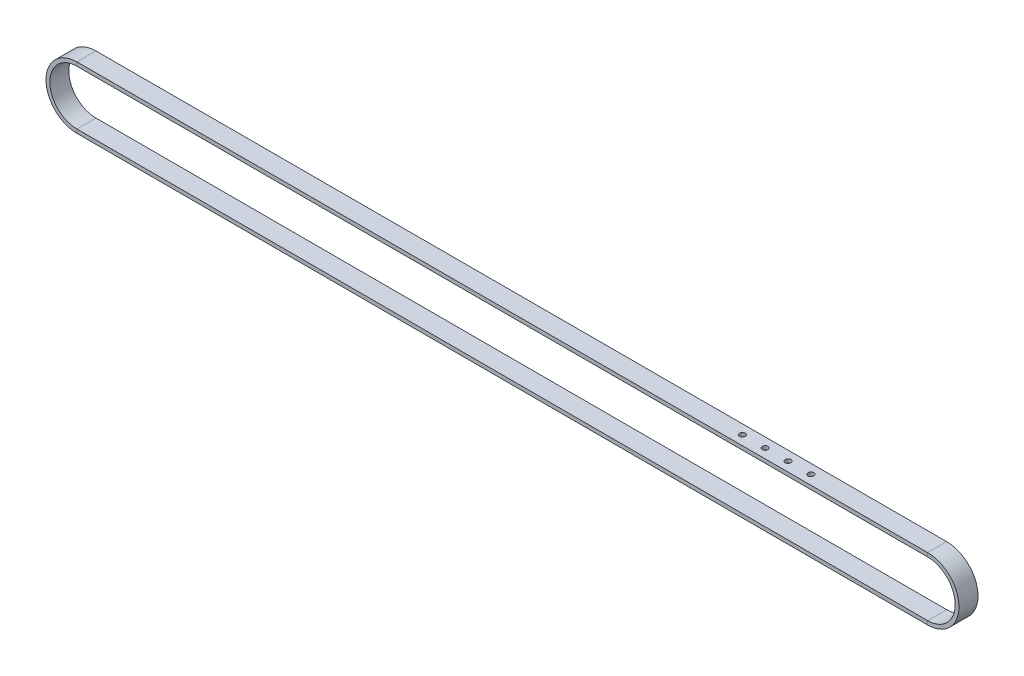
ISO-10303-21;
HEADER;
FILE_DESCRIPTION(('STEP AP214'),'2;1');
FILE_NAME('part.step','',(''),(''),'','','');
FILE_SCHEMA(('AUTOMOTIVE_DESIGN { 1 0 10303 214 1 1 1 1 }'));
ENDSEC;
DATA;
#1=APPLICATION_CONTEXT('core data for automotive mechanical design processes');
#2=APPLICATION_PROTOCOL_DEFINITION('international standard','automotive_design',2000,#1);
#3=PRODUCT_CONTEXT('',#1,'mechanical');
#4=PRODUCT('Part','Part','',(#3));
#5=PRODUCT_RELATED_PRODUCT_CATEGORY('part','',(#4));
#6=PRODUCT_DEFINITION_FORMATION('','',#4);
#7=PRODUCT_DEFINITION_CONTEXT('part definition',#1,'design');
#8=PRODUCT_DEFINITION('design','',#6,#7);
#9=PRODUCT_DEFINITION_SHAPE('','',#8);
#10=(LENGTH_UNIT() NAMED_UNIT(*) SI_UNIT(.MILLI.,.METRE.));
#11=(NAMED_UNIT(*) PLANE_ANGLE_UNIT() SI_UNIT($,.RADIAN.));
#12=(NAMED_UNIT(*) SI_UNIT($,.STERADIAN.) SOLID_ANGLE_UNIT());
#13=UNCERTAINTY_MEASURE_WITH_UNIT(LENGTH_MEASURE(1.E-05),#10,'distance_accuracy_value','');
#14=(GEOMETRIC_REPRESENTATION_CONTEXT(3) GLOBAL_UNCERTAINTY_ASSIGNED_CONTEXT((#13)) GLOBAL_UNIT_ASSIGNED_CONTEXT((#10,
#11,#12)) REPRESENTATION_CONTEXT('',''));
#15=CARTESIAN_POINT('',(0.,0.,0.));
#16=DIRECTION('',(0.,0.,1.));
#17=DIRECTION('',(1.,0.,0.));
#18=AXIS2_PLACEMENT_3D('',#15,#16,#17);
#19=CARTESIAN_POINT('',(-0.00679161377602913,14.2874973611801,-5.));
#20=DIRECTION('',(0.,0.,1.));
#21=DIRECTION('',(1.,0.,0.));
#22=AXIS2_PLACEMENT_3D('',#19,#20,#21);
#23=PLANE('',#22);
#24=CARTESIAN_POINT('',(0.,0.,-5.));
#25=DIRECTION('',(0.,0.,1.));
#26=DIRECTION('',(-0.000416983225536564,0.999999913062491,0.));
#27=AXIS2_PLACEMENT_3D('',#24,#25,#26);
#28=CIRCLE('',#27,16.2874987771746);
#29=CARTESIAN_POINT('',(-0.0067916137760915,16.2874973611801,-5.));
#30=VERTEX_POINT('',#29);
#31=CARTESIAN_POINT('',(-0.00869302676762121,-16.2874964573366,-5.));
#32=VERTEX_POINT('',#31);
#33=EDGE_CURVE('E170',#30,#32,#28,.T.);
#34=ORIENTED_EDGE('',*,*,#33,.F.);
#35=DIRECTION('',(0.,1.,0.));
#36=VECTOR('',#35,1.);
#37=CARTESIAN_POINT('',(-0.00679161377602913,14.2874973611801,-5.));
#38=LINE('',#37,#36);
#39=CARTESIAN_POINT('',(-0.0067916137760915,14.2874973611801,-5.));
#40=VERTEX_POINT('',#39);
#41=EDGE_CURVE('E172',#40,#30,#38,.T.);
#42=ORIENTED_EDGE('',*,*,#41,.F.);
#43=CARTESIAN_POINT('',(0.,0.,-5.));
#44=DIRECTION('',(0.,0.,1.));
#45=DIRECTION('',(-0.000475353579218308,0.999999887019481,0.));
#46=AXIS2_PLACEMENT_3D('',#43,#44,#45);
#47=CIRCLE('',#46,14.2874989753891);
#48=CARTESIAN_POINT('',(-0.00679161280192785,-14.2874973611805,-5.));
#49=VERTEX_POINT('',#48);
#50=EDGE_CURVE('E173',#40,#49,#47,.T.);
#51=ORIENTED_EDGE('',*,*,#50,.T.);
#52=DIRECTION('',(-0.000950706982846778,-0.999999548078014,0.));
#53=VECTOR('',#52,1.);
#54=CARTESIAN_POINT('',(-0.00679161280192926,-14.2874973611805,-5.));
#55=LINE('',#54,#53);
#56=EDGE_CURVE('E176',#49,#32,#55,.T.);
#57=ORIENTED_EDGE('',*,*,#56,.T.);
#58=EDGE_LOOP('',(#34,#42,#51,#57));
#59=FACE_BOUND('',#58,.T.);
#60=ADVANCED_FACE('F33',(#59),#23,.F.);
#61=CARTESIAN_POINT('',(0.,0.,0.));
#62=DIRECTION('',(0.,0.,1.));
#63=DIRECTION('',(1.,0.,0.));
#64=AXIS2_PLACEMENT_3D('',#61,#62,#63);
#65=CYLINDRICAL_SURFACE('',#64,16.2874987771746);
#66=CARTESIAN_POINT('',(0.,0.,5.));
#67=DIRECTION('',(0.,0.,1.));
#68=DIRECTION('',(-0.000416983225536564,0.999999913062491,0.));
#69=AXIS2_PLACEMENT_3D('',#66,#67,#68);
#70=CIRCLE('',#69,16.2874987771746);
#71=CARTESIAN_POINT('',(-0.0067916137760915,16.2874973611801,5.));
#72=VERTEX_POINT('',#71);
#73=CARTESIAN_POINT('',(-0.00869302676762121,-16.2874964573366,5.));
#74=VERTEX_POINT('',#73);
#75=EDGE_CURVE('E159',#72,#74,#70,.T.);
#76=ORIENTED_EDGE('',*,*,#75,.F.);
#77=DIRECTION('',(0.,0.,1.));
#78=VECTOR('',#77,1.);
#79=CARTESIAN_POINT('',(-0.00679161377602913,16.2874973611801,5.));
#80=LINE('',#79,#78);
#81=EDGE_CURVE('E167',#30,#72,#80,.T.);
#82=ORIENTED_EDGE('',*,*,#81,.F.);
#83=ORIENTED_EDGE('',*,*,#33,.T.);
#84=DIRECTION('',(0.,0.,1.));
#85=VECTOR('',#84,1.);
#86=CARTESIAN_POINT('',(-0.00869302676762282,-16.2874964573366,5.));
#87=LINE('',#86,#85);
#88=EDGE_CURVE('E162',#32,#74,#87,.T.);
#89=ORIENTED_EDGE('',*,*,#88,.T.);
#90=EDGE_LOOP('',(#76,#82,#83,#89));
#91=FACE_BOUND('',#90,.T.);
#92=ADVANCED_FACE('F340',(#91),#65,.T.);
#93=CARTESIAN_POINT('',(-0.00679161377602913,14.2874973611801,5.));
#94=DIRECTION('',(0.,0.,-1.));
#95=DIRECTION('',(-1.,0.,0.));
#96=AXIS2_PLACEMENT_3D('',#93,#94,#95);
#97=PLANE('',#96);
#98=CARTESIAN_POINT('',(0.,0.,5.));
#99=DIRECTION('',(0.,0.,1.));
#100=DIRECTION('',(-0.000475353579218308,0.999999887019481,0.));
#101=AXIS2_PLACEMENT_3D('',#98,#99,#100);
#102=CIRCLE('',#101,14.2874989753891);
#103=CARTESIAN_POINT('',(-0.0067916137760915,14.2874973611801,5.));
#104=VERTEX_POINT('',#103);
#105=CARTESIAN_POINT('',(-0.00679161280192785,-14.2874973611805,5.));
#106=VERTEX_POINT('',#105);
#107=EDGE_CURVE('E146',#104,#106,#102,.T.);
#108=ORIENTED_EDGE('',*,*,#107,.F.);
#109=DIRECTION('',(0.,-1.,0.));
#110=VECTOR('',#109,1.);
#111=CARTESIAN_POINT('',(-0.00679161377602913,14.2874973611801,5.));
#112=LINE('',#111,#110);
#113=EDGE_CURVE('E166',#72,#104,#112,.T.);
#114=ORIENTED_EDGE('',*,*,#113,.F.);
#115=ORIENTED_EDGE('',*,*,#75,.T.);
#116=DIRECTION('',(0.000950706982846778,0.999999548078014,0.));
#117=VECTOR('',#116,1.);
#118=CARTESIAN_POINT('',(-0.00679161280192926,-14.2874973611805,5.));
#119=LINE('',#118,#117);
#120=EDGE_CURVE('E130',#74,#106,#119,.T.);
#121=ORIENTED_EDGE('',*,*,#120,.T.);
#122=EDGE_LOOP('',(#108,#114,#115,#121));
#123=FACE_BOUND('',#122,.T.);
#124=ADVANCED_FACE('F157',(#123),#97,.F.);
#125=CARTESIAN_POINT('',(0.,0.,0.));
#126=DIRECTION('',(0.,0.,1.));
#127=DIRECTION('',(1.,0.,0.));
#128=AXIS2_PLACEMENT_3D('',#125,#126,#127);
#129=CYLINDRICAL_SURFACE('',#128,14.2874989753891);
#130=DIRECTION('',(0.,0.,-1.));
#131=VECTOR('',#130,1.);
#132=CARTESIAN_POINT('',(-0.00679161280192926,-14.2874973611805,5.));
#133=LINE('',#132,#131);
#134=EDGE_CURVE('E140',#106,#49,#133,.T.);
#135=ORIENTED_EDGE('',*,*,#134,.T.);
#136=ORIENTED_EDGE('',*,*,#50,.F.);
#137=DIRECTION('',(0.,0.,-1.));
#138=VECTOR('',#137,1.);
#139=CARTESIAN_POINT('',(-0.00679161377602913,14.2874973611801,5.));
#140=LINE('',#139,#138);
#141=EDGE_CURVE('E152',#104,#40,#140,.T.);
#142=ORIENTED_EDGE('',*,*,#141,.F.);
#143=ORIENTED_EDGE('',*,*,#107,.T.);
#144=EDGE_LOOP('',(#135,#136,#142,#143));
#145=FACE_BOUND('',#144,.T.);
#146=ADVANCED_FACE('F150',(#145),#129,.F.);
#147=CARTESIAN_POINT('',(-0.00679161280192698,-14.2874973611805,-5.));
#148=DIRECTION('',(0.,0.,1.));
#149=DIRECTION('',(1.,0.,0.));
#150=AXIS2_PLACEMENT_3D('',#147,#148,#149);
#151=PLANE('',#150);
#152=DIRECTION('',(0.999999887019497,-0.000475353545129085,0.));
#153=VECTOR('',#152,1.);
#154=CARTESIAN_POINT('',(-0.00869302676762022,-16.2874964573366,-5.));
#155=LINE('',#154,#153);
#156=CARTESIAN_POINT('',(447.491681208891,-16.5002174742748,-5.));
#157=VERTEX_POINT('',#156);
#158=EDGE_CURVE('E350',#32,#157,#155,.T.);
#159=ORIENTED_EDGE('',*,*,#158,.F.);
#160=ORIENTED_EDGE('',*,*,#56,.F.);
#161=DIRECTION('',(0.999999887019497,-0.000475353545129085,0.));
#162=VECTOR('',#161,1.);
#163=CARTESIAN_POINT('',(-0.00679161280192698,-14.2874973611805,-5.));
#164=LINE('',#163,#162);
#165=CARTESIAN_POINT('',(447.493107269207,-14.5002180485922,-5.));
#166=VERTEX_POINT('',#165);
#167=EDGE_CURVE('E143',#49,#166,#164,.T.);
#168=ORIENTED_EDGE('',*,*,#167,.T.);
#169=DIRECTION('',(-0.000475353545128899,-0.999999887019497,0.));
#170=VECTOR('',#169,1.);
#171=CARTESIAN_POINT('',(447.493107269167,-14.5002180485922,-5.));
#172=LINE('',#171,#170);
#173=EDGE_CURVE('E37',#166,#157,#172,.T.);
#174=ORIENTED_EDGE('',*,*,#173,.T.);
#175=EDGE_LOOP('',(#159,#160,#168,#174));
#176=FACE_BOUND('',#175,.T.);
#177=ADVANCED_FACE('F344',(#176),#151,.F.);
#178=CARTESIAN_POINT('',(-0.00869302676762022,-16.2874964573366,5.));
#179=DIRECTION('',(0.000475353545129085,0.999999887019497,0.));
#180=DIRECTION('',(-0.999999887019497,0.000475353545129085,0.));
#181=AXIS2_PLACEMENT_3D('',#178,#179,#180);
#182=PLANE('',#181);
#183=DIRECTION('',(0.999999887019497,-0.000475353545129085,0.));
#184=VECTOR('',#183,1.);
#185=CARTESIAN_POINT('',(-0.00869302676762022,-16.2874964573366,5.));
#186=LINE('',#185,#184);
#187=CARTESIAN_POINT('',(447.491747230197,-16.5002174840037,5.));
#188=VERTEX_POINT('',#187);
#189=EDGE_CURVE('E136',#74,#188,#186,.T.);
#190=ORIENTED_EDGE('',*,*,#189,.F.);
#191=ORIENTED_EDGE('',*,*,#88,.F.);
#192=ORIENTED_EDGE('',*,*,#158,.T.);
#193=DIRECTION('',(0.,0.,1.));
#194=VECTOR('',#193,1.);
#195=CARTESIAN_POINT('',(447.492156562076,-16.5002178226312,5.));
#196=LINE('',#195,#194);
#197=EDGE_CURVE('E78',#157,#188,#196,.T.);
#198=ORIENTED_EDGE('',*,*,#197,.T.);
#199=EDGE_LOOP('',(#190,#191,#192,#198));
#200=FACE_BOUND('',#199,.T.);
#201=ADVANCED_FACE('F337',(#200),#182,.F.);
#202=CARTESIAN_POINT('',(-0.00679161280192698,-14.2874973611805,5.));
#203=DIRECTION('',(0.,0.,-1.));
#204=DIRECTION('',(-1.,0.,0.));
#205=AXIS2_PLACEMENT_3D('',#202,#203,#204);
#206=PLANE('',#205);
#207=DIRECTION('',(0.999999887019497,-0.000475353545129085,0.));
#208=VECTOR('',#207,1.);
#209=CARTESIAN_POINT('',(-0.00679161280192698,-14.2874973611805,5.));
#210=LINE('',#209,#208);
#211=CARTESIAN_POINT('',(447.493107269207,-14.5002180485922,5.));
#212=VERTEX_POINT('',#211);
#213=EDGE_CURVE('E125',#106,#212,#210,.T.);
#214=ORIENTED_EDGE('',*,*,#213,.F.);
#215=ORIENTED_EDGE('',*,*,#120,.F.);
#216=ORIENTED_EDGE('',*,*,#189,.T.);
#217=DIRECTION('',(0.000475353545128899,0.999999887019497,0.));
#218=VECTOR('',#217,1.);
#219=CARTESIAN_POINT('',(447.493107269167,-14.5002180485922,5.));
#220=LINE('',#219,#218);
#221=EDGE_CURVE('E132',#188,#212,#220,.T.);
#222=ORIENTED_EDGE('',*,*,#221,.T.);
#223=EDGE_LOOP('',(#214,#215,#216,#222));
#224=FACE_BOUND('',#223,.T.);
#225=ADVANCED_FACE('F127',(#224),#206,.F.);
#226=CARTESIAN_POINT('',(-0.00679161280192698,-14.2874973611805,5.));
#227=DIRECTION('',(-0.000475353545129085,-0.999999887019497,0.));
#228=DIRECTION('',(0.999999887019497,-0.000475353545129085,0.));
#229=AXIS2_PLACEMENT_3D('',#226,#227,#228);
#230=PLANE('',#229);
#231=DIRECTION('',(0.,0.,-1.));
#232=VECTOR('',#231,1.);
#233=CARTESIAN_POINT('',(447.493107269167,-14.5002180485922,5.));
#234=LINE('',#233,#232);
#235=EDGE_CURVE('E276',#212,#166,#234,.T.);
#236=ORIENTED_EDGE('',*,*,#235,.T.);
#237=ORIENTED_EDGE('',*,*,#167,.F.);
#238=ORIENTED_EDGE('',*,*,#134,.F.);
#239=ORIENTED_EDGE('',*,*,#213,.T.);
#240=EDGE_LOOP('',(#236,#237,#238,#239));
#241=FACE_BOUND('',#240,.T.);
#242=ADVANCED_FACE('F142',(#241),#230,.F.);
#243=CARTESIAN_POINT('',(447.49310726868,14.500218048592,5.));
#244=DIRECTION('',(-0.000475353545128899,0.999999887019497,0.));
#245=DIRECTION('',(-0.999999887019497,-0.000475353545128899,0.));
#246=AXIS2_PLACEMENT_3D('',#243,#244,#245);
#247=PLANE('',#246);
#248=CARTESIAN_POINT('',(345.088089316183,14.4515394547695,0.0166150031191137));
#249=DIRECTION('',(-0.000475353545128899,0.999999887019497,0.));
#250=DIRECTION('',(-0.999999887019497,-0.000475353545128899,0.));
#251=AXIS2_PLACEMENT_3D('',#248,#249,#250);
#252=CIRCLE('',#251,1.49999999999997);
#253=CARTESIAN_POINT('',(343.588089485654,14.4508264244518,0.0166150031191137));
#254=VERTEX_POINT('',#253);
#255=EDGE_CURVE('E137',#254,#254,#252,.T.);
#256=ORIENTED_EDGE('',*,*,#255,.T.);
#257=EDGE_LOOP('',(#256));
#258=FACE_BOUND('',#257,.T.);
#259=CARTESIAN_POINT('',(357.088087960417,14.4572436973111,0.0166150031191137));
#260=DIRECTION('',(-0.000475353545128899,0.999999887019497,0.));
#261=DIRECTION('',(-0.999999887019497,-0.000475353545128899,0.));
#262=AXIS2_PLACEMENT_3D('',#259,#260,#261);
#263=CIRCLE('',#262,1.50000000000012);
#264=CARTESIAN_POINT('',(355.588088129888,14.4565306669934,0.0166150031191137));
#265=VERTEX_POINT('',#264);
#266=EDGE_CURVE('E406',#265,#265,#263,.T.);
#267=ORIENTED_EDGE('',*,*,#266,.T.);
#268=EDGE_LOOP('',(#267));
#269=FACE_BOUND('',#268,.T.);
#270=CARTESIAN_POINT('',(369.088086604651,14.4629479398526,0.0166150031191137));
#271=DIRECTION('',(-0.000475353545128899,0.999999887019497,0.));
#272=DIRECTION('',(-0.999999887019497,-0.000475353545128899,0.));
#273=AXIS2_PLACEMENT_3D('',#270,#271,#272);
#274=CIRCLE('',#273,1.50000000000007);
#275=CARTESIAN_POINT('',(367.588086774122,14.4622349095349,0.0166150031191137));
#276=VERTEX_POINT('',#275);
#277=EDGE_CURVE('E409',#276,#276,#274,.T.);
#278=ORIENTED_EDGE('',*,*,#277,.T.);
#279=EDGE_LOOP('',(#278));
#280=FACE_BOUND('',#279,.T.);
#281=CARTESIAN_POINT('',(381.088085248885,14.4686521823942,0.0166150031191137));
#282=DIRECTION('',(-0.000475353545128899,0.999999887019497,0.));
#283=DIRECTION('',(-0.999999887019497,-0.000475353545128899,0.));
#284=AXIS2_PLACEMENT_3D('',#281,#282,#283);
#285=CIRCLE('',#284,1.50000000000007);
#286=CARTESIAN_POINT('',(379.588085418356,14.4679391520765,0.0166150031191137));
#287=VERTEX_POINT('',#286);
#288=EDGE_CURVE('E412',#287,#287,#285,.T.);
#289=ORIENTED_EDGE('',*,*,#288,.T.);
#290=EDGE_LOOP('',(#289));
#291=FACE_BOUND('',#290,.T.);
#292=DIRECTION('',(-0.999999887019497,-0.000475353545128899,0.));
#293=VECTOR('',#292,1.);
#294=CARTESIAN_POINT('',(447.49310726868,14.500218048592,-5.));
#295=LINE('',#294,#293);
#296=CARTESIAN_POINT('',(447.493107268355,14.5002180485921,-5.));
#297=VERTEX_POINT('',#296);
#298=EDGE_CURVE('E94',#297,#40,#295,.T.);
#299=ORIENTED_EDGE('',*,*,#298,.F.);
#300=DIRECTION('',(0.,0.,-1.));
#301=VECTOR('',#300,1.);
#302=CARTESIAN_POINT('',(447.493107268193,14.5002180485921,5.));
#303=LINE('',#302,#301);
#304=CARTESIAN_POINT('',(447.493107268355,14.5002180485921,5.));
#305=VERTEX_POINT('',#304);
#306=EDGE_CURVE('E11',#305,#297,#303,.T.);
#307=ORIENTED_EDGE('',*,*,#306,.F.);
#308=DIRECTION('',(-0.999999887019497,-0.000475353545128899,0.));
#309=VECTOR('',#308,1.);
#310=CARTESIAN_POINT('',(447.49310726868,14.500218048592,5.));
#311=LINE('',#310,#309);
#312=EDGE_CURVE('E265',#305,#104,#311,.T.);
#313=ORIENTED_EDGE('',*,*,#312,.T.);
#314=ORIENTED_EDGE('',*,*,#141,.T.);
#315=EDGE_LOOP('',(#299,#307,#313,#314));
#316=FACE_BOUND('',#315,.T.);
#317=ADVANCED_FACE('F35',(#258,#269,#280,#291,#316),#247,.F.);
#318=CARTESIAN_POINT('',(447.49310726868,14.500218048592,5.));
#319=DIRECTION('',(0.,0.,-1.));
#320=DIRECTION('',(-1.,0.,0.));
#321=AXIS2_PLACEMENT_3D('',#318,#319,#320);
#322=PLANE('',#321);
#323=ORIENTED_EDGE('',*,*,#312,.F.);
#324=DIRECTION('',(-0.000475353545128899,-0.999999887019497,0.));
#325=VECTOR('',#324,1.);
#326=CARTESIAN_POINT('',(447.493107268193,14.5002180485921,5.));
#327=LINE('',#326,#325);
#328=CARTESIAN_POINT('',(447.493582621978,16.5002179243135,5.));
#329=VERTEX_POINT('',#328);
#330=EDGE_CURVE('E53',#329,#305,#327,.T.);
#331=ORIENTED_EDGE('',*,*,#330,.F.);
#332=DIRECTION('',(-0.999999887019497,-0.000475353545128899,0.));
#333=VECTOR('',#332,1.);
#334=CARTESIAN_POINT('',(447.49310726868,16.500218048592,5.));
#335=LINE('',#334,#333);
#336=EDGE_CURVE('E187',#329,#72,#335,.T.);
#337=ORIENTED_EDGE('',*,*,#336,.T.);
#338=ORIENTED_EDGE('',*,*,#113,.T.);
#339=EDGE_LOOP('',(#323,#331,#337,#338));
#340=FACE_BOUND('',#339,.T.);
#341=ADVANCED_FACE('F189',(#340),#322,.F.);
#342=CARTESIAN_POINT('',(447.49310726868,16.500218048592,5.));
#343=DIRECTION('',(0.000475353545128899,-0.999999887019497,0.));
#344=DIRECTION('',(0.999999887019497,0.000475353545128899,0.));
#345=AXIS2_PLACEMENT_3D('',#342,#343,#344);
#346=PLANE('',#345);
#347=CARTESIAN_POINT('',(345.0871386092,16.4515390028476,0.0166150031191137));
#348=DIRECTION('',(-0.000475353545128992,0.999999887019497,0.));
#349=DIRECTION('',(-0.999999887019497,-0.000475353545128992,0.));
#350=AXIS2_PLACEMENT_3D('',#347,#348,#349);
#351=CIRCLE('',#350,1.49999999999997);
#352=CARTESIAN_POINT('',(343.587138778671,16.4508259725299,0.0166150031191137));
#353=VERTEX_POINT('',#352);
#354=EDGE_CURVE('E415',#353,#353,#351,.T.);
#355=ORIENTED_EDGE('',*,*,#354,.F.);
#356=EDGE_LOOP('',(#355));
#357=FACE_BOUND('',#356,.T.);
#358=CARTESIAN_POINT('',(357.087137253434,16.4572432453891,0.0166150031191137));
#359=DIRECTION('',(-0.000475353545128992,0.999999887019497,0.));
#360=DIRECTION('',(-0.999999887019497,-0.000475353545128992,0.));
#361=AXIS2_PLACEMENT_3D('',#358,#359,#360);
#362=CIRCLE('',#361,1.50000000000012);
#363=CARTESIAN_POINT('',(355.587137422905,16.4565302150714,0.0166150031191137));
#364=VERTEX_POINT('',#363);
#365=EDGE_CURVE('E422',#364,#364,#362,.T.);
#366=ORIENTED_EDGE('',*,*,#365,.F.);
#367=EDGE_LOOP('',(#366));
#368=FACE_BOUND('',#367,.T.);
#369=CARTESIAN_POINT('',(369.087135897668,16.4629474879307,0.0166150031191137));
#370=DIRECTION('',(-0.000475353545128992,0.999999887019497,0.));
#371=DIRECTION('',(-0.999999887019497,-0.000475353545128992,0.));
#372=AXIS2_PLACEMENT_3D('',#369,#370,#371);
#373=CIRCLE('',#372,1.50000000000007);
#374=CARTESIAN_POINT('',(367.587136067139,16.462234457613,0.0166150031191137));
#375=VERTEX_POINT('',#374);
#376=EDGE_CURVE('E419',#375,#375,#373,.T.);
#377=ORIENTED_EDGE('',*,*,#376,.F.);
#378=EDGE_LOOP('',(#377));
#379=FACE_BOUND('',#378,.T.);
#380=CARTESIAN_POINT('',(381.087134541902,16.4686517304722,0.0166150031191137));
#381=DIRECTION('',(-0.000475353545128992,0.999999887019497,0.));
#382=DIRECTION('',(-0.999999887019497,-0.000475353545128992,0.));
#383=AXIS2_PLACEMENT_3D('',#380,#381,#382);
#384=CIRCLE('',#383,1.50000000000007);
#385=CARTESIAN_POINT('',(379.587134711373,16.4679387001545,0.0166150031191137));
#386=VERTEX_POINT('',#385);
#387=EDGE_CURVE('E416',#386,#386,#384,.T.);
#388=ORIENTED_EDGE('',*,*,#387,.F.);
#389=EDGE_LOOP('',(#388));
#390=FACE_BOUND('',#389,.T.);
#391=ORIENTED_EDGE('',*,*,#336,.F.);
#392=DIRECTION('',(0.,0.,1.));
#393=VECTOR('',#392,1.);
#394=CARTESIAN_POINT('',(447.494057975283,16.5002178226311,5.));
#395=LINE('',#394,#393);
#396=CARTESIAN_POINT('',(447.493582621978,16.5002179243135,-5.));
#397=VERTEX_POINT('',#396);
#398=EDGE_CURVE('E236',#397,#329,#395,.T.);
#399=ORIENTED_EDGE('',*,*,#398,.F.);
#400=DIRECTION('',(-0.999999887019497,-0.000475353545128899,0.));
#401=VECTOR('',#400,1.);
#402=CARTESIAN_POINT('',(447.49310726868,16.500218048592,-5.));
#403=LINE('',#402,#401);
#404=EDGE_CURVE('E102',#397,#30,#403,.T.);
#405=ORIENTED_EDGE('',*,*,#404,.T.);
#406=ORIENTED_EDGE('',*,*,#81,.T.);
#407=EDGE_LOOP('',(#391,#399,#405,#406));
#408=FACE_BOUND('',#407,.T.);
#409=ADVANCED_FACE('F198',(#357,#368,#379,#390,#408),#346,.F.);
#410=CARTESIAN_POINT('',(447.49310726868,14.500218048592,-5.));
#411=DIRECTION('',(0.,0.,1.));
#412=DIRECTION('',(1.,0.,0.));
#413=AXIS2_PLACEMENT_3D('',#410,#411,#412);
#414=PLANE('',#413);
#415=ORIENTED_EDGE('',*,*,#404,.F.);
#416=DIRECTION('',(0.000475353545128899,0.999999887019497,0.));
#417=VECTOR('',#416,1.);
#418=CARTESIAN_POINT('',(447.493107268193,14.5002180485921,-5.));
#419=LINE('',#418,#417);
#420=EDGE_CURVE('E244',#297,#397,#419,.T.);
#421=ORIENTED_EDGE('',*,*,#420,.F.);
#422=ORIENTED_EDGE('',*,*,#298,.T.);
#423=ORIENTED_EDGE('',*,*,#41,.T.);
#424=EDGE_LOOP('',(#415,#421,#422,#423));
#425=FACE_BOUND('',#424,.T.);
#426=ADVANCED_FACE('F202',(#425),#414,.F.);
#427=CARTESIAN_POINT('',(447.493107269167,-14.5002180485922,-5.));
#428=DIRECTION('',(0.,0.,1.));
#429=DIRECTION('',(1.,0.,0.));
#430=AXIS2_PLACEMENT_3D('',#427,#428,#429);
#431=PLANE('',#430);
#432=CARTESIAN_POINT('',(447.49310726868,0.,-5.));
#433=DIRECTION('',(0.,0.,1.));
#434=DIRECTION('',(-5.76178212867841E-05,-0.999999998340093,0.));
#435=AXIS2_PLACEMENT_3D('',#432,#433,#434);
#436=CIRCLE('',#435,16.5002178500199);
#437=EDGE_CURVE('E239',#157,#397,#436,.T.);
#438=ORIENTED_EDGE('',*,*,#437,.F.);
#439=ORIENTED_EDGE('',*,*,#173,.F.);
#440=CARTESIAN_POINT('',(447.49310726868,0.,-5.));
#441=DIRECTION('',(0.,0.,1.));
#442=DIRECTION('',(3.35856556170277E-11,-1.,0.));
#443=AXIS2_PLACEMENT_3D('',#440,#441,#442);
#444=CIRCLE('',#443,14.5002180485921);
#445=EDGE_CURVE('E247',#166,#297,#444,.T.);
#446=ORIENTED_EDGE('',*,*,#445,.T.);
#447=ORIENTED_EDGE('',*,*,#420,.T.);
#448=EDGE_LOOP('',(#438,#439,#446,#447));
#449=FACE_BOUND('',#448,.T.);
#450=ADVANCED_FACE('F260',(#449),#431,.F.);
#451=CARTESIAN_POINT('',(447.49310726868,0.,0.));
#452=DIRECTION('',(0.,0.,1.));
#453=DIRECTION('',(1.,0.,0.));
#454=AXIS2_PLACEMENT_3D('',#451,#452,#453);
#455=CYLINDRICAL_SURFACE('',#454,16.5002178500199);
#456=CARTESIAN_POINT('',(447.49310726868,0.,5.));
#457=DIRECTION('',(0.,0.,1.));
#458=DIRECTION('',(-5.76178212867841E-05,-0.999999998340093,0.));
#459=AXIS2_PLACEMENT_3D('',#456,#457,#458);
#460=CIRCLE('',#459,16.5002178500199);
#461=EDGE_CURVE('E222',#188,#329,#460,.T.);
#462=ORIENTED_EDGE('',*,*,#461,.F.);
#463=ORIENTED_EDGE('',*,*,#197,.F.);
#464=ORIENTED_EDGE('',*,*,#437,.T.);
#465=ORIENTED_EDGE('',*,*,#398,.T.);
#466=EDGE_LOOP('',(#462,#463,#464,#465));
#467=FACE_BOUND('',#466,.T.);
#468=ADVANCED_FACE('F258',(#467),#455,.T.);
#469=CARTESIAN_POINT('',(447.493107269167,-14.5002180485922,5.));
#470=DIRECTION('',(0.,0.,-1.));
#471=DIRECTION('',(-1.,0.,0.));
#472=AXIS2_PLACEMENT_3D('',#469,#470,#471);
#473=PLANE('',#472);
#474=CARTESIAN_POINT('',(447.49310726868,0.,5.));
#475=DIRECTION('',(0.,0.,1.));
#476=DIRECTION('',(3.35856556170277E-11,-1.,0.));
#477=AXIS2_PLACEMENT_3D('',#474,#475,#476);
#478=CIRCLE('',#477,14.5002180485921);
#479=EDGE_CURVE('E44',#212,#305,#478,.T.);
#480=ORIENTED_EDGE('',*,*,#479,.F.);
#481=ORIENTED_EDGE('',*,*,#221,.F.);
#482=ORIENTED_EDGE('',*,*,#461,.T.);
#483=ORIENTED_EDGE('',*,*,#330,.T.);
#484=EDGE_LOOP('',(#480,#481,#482,#483));
#485=FACE_BOUND('',#484,.T.);
#486=ADVANCED_FACE('F303',(#485),#473,.F.);
#487=CARTESIAN_POINT('',(447.49310726868,0.,0.));
#488=DIRECTION('',(0.,0.,1.));
#489=DIRECTION('',(1.,0.,0.));
#490=AXIS2_PLACEMENT_3D('',#487,#488,#489);
#491=CYLINDRICAL_SURFACE('',#490,14.5002180485921);
#492=ORIENTED_EDGE('',*,*,#306,.T.);
#493=ORIENTED_EDGE('',*,*,#445,.F.);
#494=ORIENTED_EDGE('',*,*,#235,.F.);
#495=ORIENTED_EDGE('',*,*,#479,.T.);
#496=EDGE_LOOP('',(#492,#493,#494,#495));
#497=FACE_BOUND('',#496,.T.);
#498=ADVANCED_FACE('F310',(#497),#491,.F.);
#499=CARTESIAN_POINT('',(381.091888077353,6.46865286027725,0.0166150031191137));
#500=DIRECTION('',(-0.000475353545128992,0.999999887019497,0.));
#501=DIRECTION('',(-0.999999887019497,-0.000475353545128992,0.));
#502=AXIS2_PLACEMENT_3D('',#499,#500,#501);
#503=CYLINDRICAL_SURFACE('',#502,1.50000000000007);
#504=ORIENTED_EDGE('',*,*,#387,.T.);
#505=EDGE_LOOP('',(#504));
#506=FACE_BOUND('',#505,.T.);
#507=ORIENTED_EDGE('',*,*,#288,.F.);
#508=EDGE_LOOP('',(#507));
#509=FACE_BOUND('',#508,.T.);
#510=ADVANCED_FACE('F378',(#506,#509),#503,.F.);
#511=CARTESIAN_POINT('',(369.091889433119,6.4629486177357,0.0166150031191137));
#512=DIRECTION('',(-0.000475353545128992,0.999999887019497,0.));
#513=DIRECTION('',(-0.999999887019497,-0.000475353545128992,0.));
#514=AXIS2_PLACEMENT_3D('',#511,#512,#513);
#515=CYLINDRICAL_SURFACE('',#514,1.50000000000007);
#516=ORIENTED_EDGE('',*,*,#376,.T.);
#517=EDGE_LOOP('',(#516));
#518=FACE_BOUND('',#517,.T.);
#519=ORIENTED_EDGE('',*,*,#277,.F.);
#520=EDGE_LOOP('',(#519));
#521=FACE_BOUND('',#520,.T.);
#522=ADVANCED_FACE('F384',(#518,#521),#515,.F.);
#523=CARTESIAN_POINT('',(357.091890788885,6.45724437519415,0.0166150031191137));
#524=DIRECTION('',(-0.000475353545128992,0.999999887019497,0.));
#525=DIRECTION('',(-0.999999887019497,-0.000475353545128992,0.));
#526=AXIS2_PLACEMENT_3D('',#523,#524,#525);
#527=CYLINDRICAL_SURFACE('',#526,1.50000000000012);
#528=ORIENTED_EDGE('',*,*,#365,.T.);
#529=EDGE_LOOP('',(#528));
#530=FACE_BOUND('',#529,.T.);
#531=ORIENTED_EDGE('',*,*,#266,.F.);
#532=EDGE_LOOP('',(#531));
#533=FACE_BOUND('',#532,.T.);
#534=ADVANCED_FACE('F451',(#530,#533),#527,.F.);
#535=CARTESIAN_POINT('',(345.091892144652,6.45154013265261,0.0166150031191137));
#536=DIRECTION('',(-0.000475353545128992,0.999999887019497,0.));
#537=DIRECTION('',(-0.999999887019497,-0.000475353545128992,0.));
#538=AXIS2_PLACEMENT_3D('',#535,#536,#537);
#539=CYLINDRICAL_SURFACE('',#538,1.49999999999997);
#540=ORIENTED_EDGE('',*,*,#354,.T.);
#541=EDGE_LOOP('',(#540));
#542=FACE_BOUND('',#541,.T.);
#543=ORIENTED_EDGE('',*,*,#255,.F.);
#544=EDGE_LOOP('',(#543));
#545=FACE_BOUND('',#544,.T.);
#546=ADVANCED_FACE('F428',(#542,#545),#539,.F.);
#547=CLOSED_SHELL('',(#60,#92,#124,#146,#177,#201,#225,#242,#317,#341,#409,#426,#450,#468,#486,
#498,#510,#522,#534,#546));
#548=MANIFOLD_SOLID_BREP('B2',#547);
#549=ADVANCED_BREP_SHAPE_REPRESENTATION('',(#18,#548),#14);
#550=SHAPE_DEFINITION_REPRESENTATION(#9,#549);
ENDSEC;
END-ISO-10303-21;
